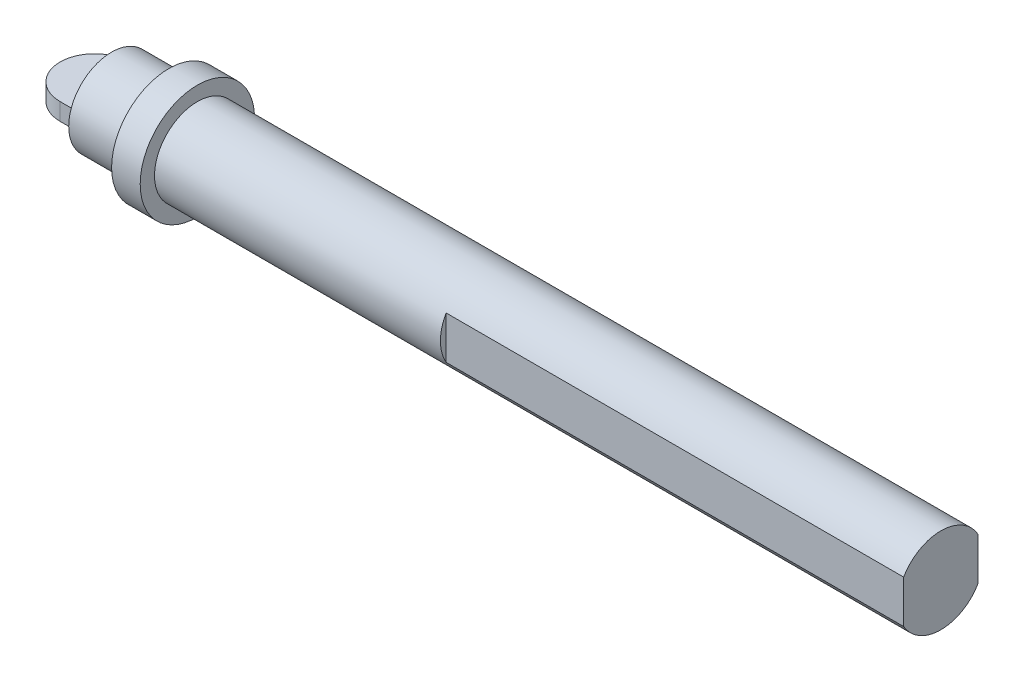
ISO-10303-21;
HEADER;
FILE_DESCRIPTION(('STEP AP214'),'2;1');
FILE_NAME('part.step','',(''),(''),'','','');
FILE_SCHEMA(('AUTOMOTIVE_DESIGN { 1 0 10303 214 1 1 1 1 }'));
ENDSEC;
DATA;
#1=APPLICATION_CONTEXT('core data for automotive mechanical design processes');
#2=APPLICATION_PROTOCOL_DEFINITION('international standard','automotive_design',2000,#1);
#3=PRODUCT_CONTEXT('',#1,'mechanical');
#4=PRODUCT('Part','Part','',(#3));
#5=PRODUCT_RELATED_PRODUCT_CATEGORY('part','',(#4));
#6=PRODUCT_DEFINITION_FORMATION('','',#4);
#7=PRODUCT_DEFINITION_CONTEXT('part definition',#1,'design');
#8=PRODUCT_DEFINITION('design','',#6,#7);
#9=PRODUCT_DEFINITION_SHAPE('','',#8);
#10=(LENGTH_UNIT() NAMED_UNIT(*) SI_UNIT(.MILLI.,.METRE.));
#11=(NAMED_UNIT(*) PLANE_ANGLE_UNIT() SI_UNIT($,.RADIAN.));
#12=(NAMED_UNIT(*) SI_UNIT($,.STERADIAN.) SOLID_ANGLE_UNIT());
#13=UNCERTAINTY_MEASURE_WITH_UNIT(LENGTH_MEASURE(1.E-05),#10,'distance_accuracy_value','');
#14=(GEOMETRIC_REPRESENTATION_CONTEXT(3) GLOBAL_UNCERTAINTY_ASSIGNED_CONTEXT((#13)) GLOBAL_UNIT_ASSIGNED_CONTEXT((#10,
#11,#12)) REPRESENTATION_CONTEXT('',''));
#15=CARTESIAN_POINT('',(0.,0.,0.));
#16=DIRECTION('',(0.,0.,1.));
#17=DIRECTION('',(1.,0.,0.));
#18=AXIS2_PLACEMENT_3D('',#15,#16,#17);
#19=CARTESIAN_POINT('',(145.,7.49999999999998,0.));
#20=DIRECTION('',(-1.,0.,0.));
#21=DIRECTION('',(0.,0.,1.));
#22=AXIS2_PLACEMENT_3D('',#19,#20,#21);
#23=PLANE('',#22);
#24=CARTESIAN_POINT('',(145.,0.,0.));
#25=DIRECTION('',(-1.,0.,0.));
#26=DIRECTION('',(0.,0.,1.));
#27=AXIS2_PLACEMENT_3D('',#24,#25,#26);
#28=CIRCLE('',#27,7.49999999999998);
#29=CARTESIAN_POINT('',(145.,-3.74165738677392,-6.49999999999999));
#30=VERTEX_POINT('',#29);
#31=CARTESIAN_POINT('',(145.,-3.74165738677391,6.5));
#32=VERTEX_POINT('',#31);
#33=EDGE_CURVE('E191',#30,#32,#28,.T.);
#34=ORIENTED_EDGE('',*,*,#33,.F.);
#35=DIRECTION('',(0.,-1.,0.));
#36=VECTOR('',#35,1.);
#37=CARTESIAN_POINT('',(145.,3.74165738677391,-6.5));
#38=LINE('',#37,#36);
#39=CARTESIAN_POINT('',(145.,3.74165738677391,-6.5));
#40=VERTEX_POINT('',#39);
#41=EDGE_CURVE('E160',#40,#30,#38,.T.);
#42=ORIENTED_EDGE('',*,*,#41,.F.);
#43=CARTESIAN_POINT('',(145.,3.74165738677391,6.5));
#44=VERTEX_POINT('',#43);
#45=EDGE_CURVE('E192',#44,#40,#28,.T.);
#46=ORIENTED_EDGE('',*,*,#45,.F.);
#47=DIRECTION('',(0.,-1.,0.));
#48=VECTOR('',#47,1.);
#49=CARTESIAN_POINT('',(145.,3.74165738677391,6.5));
#50=LINE('',#49,#48);
#51=EDGE_CURVE('E164',#44,#32,#50,.T.);
#52=ORIENTED_EDGE('',*,*,#51,.T.);
#53=EDGE_LOOP('',(#34,#42,#46,#52));
#54=FACE_BOUND('',#53,.T.);
#55=ADVANCED_FACE('F65',(#54),#23,.F.);
#56=CARTESIAN_POINT('',(0.,0.,0.));
#57=DIRECTION('',(1.,0.,0.));
#58=DIRECTION('',(0.,0.,-1.));
#59=AXIS2_PLACEMENT_3D('',#56,#57,#58);
#60=PLANE('',#59);
#61=DIRECTION('',(0.,-1.,0.));
#62=VECTOR('',#61,1.);
#63=CARTESIAN_POINT('',(0.,1.5,6.));
#64=LINE('',#63,#62);
#65=CARTESIAN_POINT('',(0.,1.5,6.));
#66=VERTEX_POINT('',#65);
#67=CARTESIAN_POINT('',(0.,-1.5,6.));
#68=VERTEX_POINT('',#67);
#69=EDGE_CURVE('E139',#66,#68,#64,.T.);
#70=ORIENTED_EDGE('',*,*,#69,.T.);
#71=DIRECTION('',(0.,0.,-1.));
#72=VECTOR('',#71,1.);
#73=CARTESIAN_POINT('',(0.,-1.5,-6.));
#74=LINE('',#73,#72);
#75=CARTESIAN_POINT('',(0.,-1.5,-6.));
#76=VERTEX_POINT('',#75);
#77=EDGE_CURVE('E81',#68,#76,#74,.T.);
#78=ORIENTED_EDGE('',*,*,#77,.T.);
#79=DIRECTION('',(0.,-1.,0.));
#80=VECTOR('',#79,1.);
#81=CARTESIAN_POINT('',(0.,1.5,-6.));
#82=LINE('',#81,#80);
#83=CARTESIAN_POINT('',(0.,1.5,-6.));
#84=VERTEX_POINT('',#83);
#85=EDGE_CURVE('E166',#84,#76,#82,.T.);
#86=ORIENTED_EDGE('',*,*,#85,.F.);
#87=DIRECTION('',(0.,0.,-1.));
#88=VECTOR('',#87,1.);
#89=CARTESIAN_POINT('',(0.,1.5,-6.));
#90=LINE('',#89,#88);
#91=EDGE_CURVE('E143',#66,#84,#90,.T.);
#92=ORIENTED_EDGE('',*,*,#91,.F.);
#93=EDGE_LOOP('',(#70,#78,#86,#92));
#94=FACE_BOUND('',#93,.T.);
#95=CARTESIAN_POINT('',(0.,0.,0.));
#96=DIRECTION('',(-1.,0.,0.));
#97=DIRECTION('',(0.,0.,1.));
#98=AXIS2_PLACEMENT_3D('',#95,#96,#97);
#99=CIRCLE('',#98,7.49999999999998);
#100=CARTESIAN_POINT('',(0.,0.,7.49999999999998));
#101=VERTEX_POINT('',#100);
#102=EDGE_CURVE('E211',#101,#101,#99,.T.);
#103=ORIENTED_EDGE('',*,*,#102,.T.);
#104=EDGE_LOOP('',(#103));
#105=FACE_BOUND('',#104,.T.);
#106=ADVANCED_FACE('F67',(#94,#105),#60,.F.);
#107=CARTESIAN_POINT('',(-72.8865979381443,0.,0.));
#108=DIRECTION('',(-1.,0.,0.));
#109=DIRECTION('',(0.,0.,1.));
#110=AXIS2_PLACEMENT_3D('',#107,#108,#109);
#111=CYLINDRICAL_SURFACE('',#110,7.49999999999998);
#112=ORIENTED_EDGE('',*,*,#102,.F.);
#113=EDGE_LOOP('',(#112));
#114=FACE_BOUND('',#113,.T.);
#115=CARTESIAN_POINT('',(9.99999999999999,0.,0.));
#116=DIRECTION('',(-1.,0.,0.));
#117=DIRECTION('',(0.,0.,1.));
#118=AXIS2_PLACEMENT_3D('',#115,#116,#117);
#119=CIRCLE('',#118,7.49999999999998);
#120=CARTESIAN_POINT('',(9.99999999999999,0.,7.49999999999998));
#121=VERTEX_POINT('',#120);
#122=EDGE_CURVE('E208',#121,#121,#119,.T.);
#123=ORIENTED_EDGE('',*,*,#122,.T.);
#124=EDGE_LOOP('',(#123));
#125=FACE_BOUND('',#124,.T.);
#126=ADVANCED_FACE('F251',(#114,#125),#111,.T.);
#127=CARTESIAN_POINT('',(10.,7.49999999999998,0.));
#128=DIRECTION('',(1.,0.,0.));
#129=DIRECTION('',(0.,0.,-1.));
#130=AXIS2_PLACEMENT_3D('',#127,#128,#129);
#131=PLANE('',#130);
#132=ORIENTED_EDGE('',*,*,#122,.F.);
#133=EDGE_LOOP('',(#132));
#134=FACE_BOUND('',#133,.T.);
#135=CARTESIAN_POINT('',(9.99999999999999,0.,0.));
#136=DIRECTION('',(-1.,0.,0.));
#137=DIRECTION('',(0.,0.,1.));
#138=AXIS2_PLACEMENT_3D('',#135,#136,#137);
#139=CIRCLE('',#138,9.99999999999998);
#140=CARTESIAN_POINT('',(9.99999999999999,0.,9.99999999999998));
#141=VERTEX_POINT('',#140);
#142=EDGE_CURVE('E204',#141,#141,#139,.T.);
#143=ORIENTED_EDGE('',*,*,#142,.T.);
#144=EDGE_LOOP('',(#143));
#145=FACE_BOUND('',#144,.T.);
#146=ADVANCED_FACE('F263',(#134,#145),#131,.F.);
#147=CARTESIAN_POINT('',(-72.8865979381443,0.,0.));
#148=DIRECTION('',(-1.,0.,0.));
#149=DIRECTION('',(0.,0.,1.));
#150=AXIS2_PLACEMENT_3D('',#147,#148,#149);
#151=CYLINDRICAL_SURFACE('',#150,9.99999999999998);
#152=ORIENTED_EDGE('',*,*,#142,.F.);
#153=EDGE_LOOP('',(#152));
#154=FACE_BOUND('',#153,.T.);
#155=CARTESIAN_POINT('',(15.,0.,0.));
#156=DIRECTION('',(-1.,0.,0.));
#157=DIRECTION('',(0.,0.,1.));
#158=AXIS2_PLACEMENT_3D('',#155,#156,#157);
#159=CIRCLE('',#158,9.99999999999998);
#160=CARTESIAN_POINT('',(15.,0.,9.99999999999998));
#161=VERTEX_POINT('',#160);
#162=EDGE_CURVE('E200',#161,#161,#159,.T.);
#163=ORIENTED_EDGE('',*,*,#162,.T.);
#164=EDGE_LOOP('',(#163));
#165=FACE_BOUND('',#164,.T.);
#166=ADVANCED_FACE('F259',(#154,#165),#151,.T.);
#167=CARTESIAN_POINT('',(15.,9.99999999999998,0.));
#168=DIRECTION('',(-1.,0.,0.));
#169=DIRECTION('',(0.,0.,1.));
#170=AXIS2_PLACEMENT_3D('',#167,#168,#169);
#171=PLANE('',#170);
#172=ORIENTED_EDGE('',*,*,#162,.F.);
#173=EDGE_LOOP('',(#172));
#174=FACE_BOUND('',#173,.T.);
#175=CARTESIAN_POINT('',(15.,0.,0.));
#176=DIRECTION('',(-1.,0.,0.));
#177=DIRECTION('',(0.,0.,1.));
#178=AXIS2_PLACEMENT_3D('',#175,#176,#177);
#179=CIRCLE('',#178,7.49999999999998);
#180=CARTESIAN_POINT('',(15.,0.,7.49999999999998));
#181=VERTEX_POINT('',#180);
#182=EDGE_CURVE('E196',#181,#181,#179,.T.);
#183=ORIENTED_EDGE('',*,*,#182,.T.);
#184=EDGE_LOOP('',(#183));
#185=FACE_BOUND('',#184,.T.);
#186=ADVANCED_FACE('F256',(#174,#185),#171,.F.);
#187=CARTESIAN_POINT('',(-72.8865979381443,0.,0.));
#188=DIRECTION('',(-1.,0.,0.));
#189=DIRECTION('',(0.,0.,1.));
#190=AXIS2_PLACEMENT_3D('',#187,#188,#189);
#191=CYLINDRICAL_SURFACE('',#190,7.49999999999998);
#192=DIRECTION('',(1.,0.,0.));
#193=VECTOR('',#192,1.);
#194=CARTESIAN_POINT('',(65.,-3.74165738677391,6.5));
#195=LINE('',#194,#193);
#196=CARTESIAN_POINT('',(65.,-3.74165738677391,6.5));
#197=VERTEX_POINT('',#196);
#198=EDGE_CURVE('E89',#197,#32,#195,.T.);
#199=ORIENTED_EDGE('',*,*,#198,.F.);
#200=CARTESIAN_POINT('',(65.,0.,0.));
#201=DIRECTION('',(1.,0.,0.));
#202=DIRECTION('',(0.,0.,-1.));
#203=AXIS2_PLACEMENT_3D('',#200,#201,#202);
#204=CIRCLE('',#203,7.49999999999998);
#205=CARTESIAN_POINT('',(65.,3.74165738677391,6.5));
#206=VERTEX_POINT('',#205);
#207=EDGE_CURVE('E74',#206,#197,#204,.T.);
#208=ORIENTED_EDGE('',*,*,#207,.F.);
#209=DIRECTION('',(1.,0.,0.));
#210=VECTOR('',#209,1.);
#211=CARTESIAN_POINT('',(65.,3.74165738677391,6.5));
#212=LINE('',#211,#210);
#213=EDGE_CURVE('E181',#206,#44,#212,.T.);
#214=ORIENTED_EDGE('',*,*,#213,.T.);
#215=ORIENTED_EDGE('',*,*,#45,.T.);
#216=DIRECTION('',(1.,0.,0.));
#217=VECTOR('',#216,1.);
#218=CARTESIAN_POINT('',(65.,3.74165738677391,-6.5));
#219=LINE('',#218,#217);
#220=CARTESIAN_POINT('',(65.,3.74165738677391,-6.5));
#221=VERTEX_POINT('',#220);
#222=EDGE_CURVE('E175',#221,#40,#219,.T.);
#223=ORIENTED_EDGE('',*,*,#222,.F.);
#224=CARTESIAN_POINT('',(65.,-3.74165738677392,-6.49999999999999));
#225=VERTEX_POINT('',#224);
#226=EDGE_CURVE('E13',#225,#221,#204,.T.);
#227=ORIENTED_EDGE('',*,*,#226,.F.);
#228=DIRECTION('',(1.,0.,0.));
#229=VECTOR('',#228,1.);
#230=CARTESIAN_POINT('',(65.,-3.74165738677392,-6.49999999999999));
#231=LINE('',#230,#229);
#232=EDGE_CURVE('E187',#225,#30,#231,.T.);
#233=ORIENTED_EDGE('',*,*,#232,.T.);
#234=ORIENTED_EDGE('',*,*,#33,.T.);
#235=EDGE_LOOP('',(#199,#208,#214,#215,#223,#227,#233,#234));
#236=FACE_BOUND('',#235,.T.);
#237=ORIENTED_EDGE('',*,*,#182,.F.);
#238=EDGE_LOOP('',(#237));
#239=FACE_BOUND('',#238,.T.);
#240=ADVANCED_FACE('F224',(#236,#239),#191,.T.);
#241=CARTESIAN_POINT('',(65.,3.74165738677391,6.5));
#242=DIRECTION('',(0.,0.,1.));
#243=DIRECTION('',(1.,0.,0.));
#244=AXIS2_PLACEMENT_3D('',#241,#242,#243);
#245=PLANE('',#244);
#246=ORIENTED_EDGE('',*,*,#51,.F.);
#247=ORIENTED_EDGE('',*,*,#213,.F.);
#248=DIRECTION('',(0.,-1.,0.));
#249=VECTOR('',#248,1.);
#250=CARTESIAN_POINT('',(65.,3.74165738677391,6.5));
#251=LINE('',#250,#249);
#252=EDGE_CURVE('E173',#206,#197,#251,.T.);
#253=ORIENTED_EDGE('',*,*,#252,.T.);
#254=ORIENTED_EDGE('',*,*,#198,.T.);
#255=EDGE_LOOP('',(#246,#247,#253,#254));
#256=FACE_BOUND('',#255,.T.);
#257=ADVANCED_FACE('F222',(#256),#245,.T.);
#258=CARTESIAN_POINT('',(65.,-0.53559948569541,0.));
#259=DIRECTION('',(1.,0.,0.));
#260=DIRECTION('',(0.,0.,-1.));
#261=AXIS2_PLACEMENT_3D('',#258,#259,#260);
#262=PLANE('',#261);
#263=ORIENTED_EDGE('',*,*,#207,.T.);
#264=ORIENTED_EDGE('',*,*,#252,.F.);
#265=EDGE_LOOP('',(#263,#264));
#266=FACE_BOUND('',#265,.T.);
#267=ADVANCED_FACE('F219',(#266),#262,.T.);
#268=ORIENTED_EDGE('',*,*,#226,.T.);
#269=DIRECTION('',(0.,-1.,0.));
#270=VECTOR('',#269,1.);
#271=CARTESIAN_POINT('',(65.,3.74165738677391,-6.5));
#272=LINE('',#271,#270);
#273=EDGE_CURVE('E170',#221,#225,#272,.T.);
#274=ORIENTED_EDGE('',*,*,#273,.T.);
#275=EDGE_LOOP('',(#268,#274));
#276=FACE_BOUND('',#275,.T.);
#277=ADVANCED_FACE('F238',(#276),#262,.T.);
#278=CARTESIAN_POINT('',(65.,3.74165738677391,-6.5));
#279=DIRECTION('',(0.,0.,1.));
#280=DIRECTION('',(1.,0.,0.));
#281=AXIS2_PLACEMENT_3D('',#278,#279,#280);
#282=PLANE('',#281);
#283=ORIENTED_EDGE('',*,*,#41,.T.);
#284=ORIENTED_EDGE('',*,*,#232,.F.);
#285=ORIENTED_EDGE('',*,*,#273,.F.);
#286=ORIENTED_EDGE('',*,*,#222,.T.);
#287=EDGE_LOOP('',(#283,#284,#285,#286));
#288=FACE_BOUND('',#287,.T.);
#289=ADVANCED_FACE('F236',(#288),#282,.F.);
#290=CARTESIAN_POINT('',(-3.,1.5,0.));
#291=DIRECTION('',(0.,-1.,0.));
#292=DIRECTION('',(0.,0.,-1.));
#293=AXIS2_PLACEMENT_3D('',#290,#291,#292);
#294=CYLINDRICAL_SURFACE('',#293,6.);
#295=CARTESIAN_POINT('',(-3.,-1.5,0.));
#296=DIRECTION('',(0.,1.,0.));
#297=DIRECTION('',(0.,0.,1.));
#298=AXIS2_PLACEMENT_3D('',#295,#296,#297);
#299=CIRCLE('',#298,6.);
#300=CARTESIAN_POINT('',(-3.,-1.5,-6.));
#301=VERTEX_POINT('',#300);
#302=CARTESIAN_POINT('',(-3.,-1.5,6.));
#303=VERTEX_POINT('',#302);
#304=EDGE_CURVE('E158',#301,#303,#299,.T.);
#305=ORIENTED_EDGE('',*,*,#304,.T.);
#306=DIRECTION('',(0.,-1.,0.));
#307=VECTOR('',#306,1.);
#308=CARTESIAN_POINT('',(-3.,1.5,6.));
#309=LINE('',#308,#307);
#310=CARTESIAN_POINT('',(-3.,1.5,6.));
#311=VERTEX_POINT('',#310);
#312=EDGE_CURVE('E136',#311,#303,#309,.T.);
#313=ORIENTED_EDGE('',*,*,#312,.F.);
#314=CARTESIAN_POINT('',(-3.,1.5,0.));
#315=DIRECTION('',(0.,1.,0.));
#316=DIRECTION('',(0.,0.,1.));
#317=AXIS2_PLACEMENT_3D('',#314,#315,#316);
#318=CIRCLE('',#317,6.);
#319=CARTESIAN_POINT('',(-3.,1.5,-6.));
#320=VERTEX_POINT('',#319);
#321=EDGE_CURVE('E144',#320,#311,#318,.T.);
#322=ORIENTED_EDGE('',*,*,#321,.F.);
#323=DIRECTION('',(0.,-1.,0.));
#324=VECTOR('',#323,1.);
#325=CARTESIAN_POINT('',(-3.,1.5,-6.));
#326=LINE('',#325,#324);
#327=EDGE_CURVE('E380',#320,#301,#326,.T.);
#328=ORIENTED_EDGE('',*,*,#327,.T.);
#329=EDGE_LOOP('',(#305,#313,#322,#328));
#330=FACE_BOUND('',#329,.T.);
#331=ADVANCED_FACE('F156',(#330),#294,.T.);
#332=CARTESIAN_POINT('',(0.,1.5,6.));
#333=DIRECTION('',(0.,0.,-1.));
#334=DIRECTION('',(-1.,0.,0.));
#335=AXIS2_PLACEMENT_3D('',#332,#333,#334);
#336=PLANE('',#335);
#337=DIRECTION('',(1.,0.,0.));
#338=VECTOR('',#337,1.);
#339=CARTESIAN_POINT('',(0.,-1.5,6.));
#340=LINE('',#339,#338);
#341=EDGE_CURVE('E368',#303,#68,#340,.T.);
#342=ORIENTED_EDGE('',*,*,#341,.T.);
#343=ORIENTED_EDGE('',*,*,#69,.F.);
#344=DIRECTION('',(1.,0.,0.));
#345=VECTOR('',#344,1.);
#346=CARTESIAN_POINT('',(0.,1.5,6.));
#347=LINE('',#346,#345);
#348=EDGE_CURVE('E132',#311,#66,#347,.T.);
#349=ORIENTED_EDGE('',*,*,#348,.F.);
#350=ORIENTED_EDGE('',*,*,#312,.T.);
#351=EDGE_LOOP('',(#342,#343,#349,#350));
#352=FACE_BOUND('',#351,.T.);
#353=ADVANCED_FACE('F134',(#352),#336,.F.);
#354=CARTESIAN_POINT('',(-3.,1.5,-6.));
#355=DIRECTION('',(0.,0.,1.));
#356=DIRECTION('',(1.,0.,0.));
#357=AXIS2_PLACEMENT_3D('',#354,#355,#356);
#358=PLANE('',#357);
#359=DIRECTION('',(-1.,0.,0.));
#360=VECTOR('',#359,1.);
#361=CARTESIAN_POINT('',(-3.,-1.5,-6.));
#362=LINE('',#361,#360);
#363=EDGE_CURVE('E154',#76,#301,#362,.T.);
#364=ORIENTED_EDGE('',*,*,#363,.T.);
#365=ORIENTED_EDGE('',*,*,#327,.F.);
#366=DIRECTION('',(-1.,0.,0.));
#367=VECTOR('',#366,1.);
#368=CARTESIAN_POINT('',(-3.,1.5,-6.));
#369=LINE('',#368,#367);
#370=EDGE_CURVE('E149',#84,#320,#369,.T.);
#371=ORIENTED_EDGE('',*,*,#370,.F.);
#372=ORIENTED_EDGE('',*,*,#85,.T.);
#373=EDGE_LOOP('',(#364,#365,#371,#372));
#374=FACE_BOUND('',#373,.T.);
#375=ADVANCED_FACE('F338',(#374),#358,.F.);
#376=CARTESIAN_POINT('',(-3.,1.5,0.));
#377=DIRECTION('',(0.,1.,0.));
#378=DIRECTION('',(0.,0.,1.));
#379=AXIS2_PLACEMENT_3D('',#376,#377,#378);
#380=PLANE('',#379);
#381=ORIENTED_EDGE('',*,*,#321,.T.);
#382=ORIENTED_EDGE('',*,*,#348,.T.);
#383=ORIENTED_EDGE('',*,*,#91,.T.);
#384=ORIENTED_EDGE('',*,*,#370,.T.);
#385=EDGE_LOOP('',(#381,#382,#383,#384));
#386=FACE_BOUND('',#385,.T.);
#387=ADVANCED_FACE('F147',(#386),#380,.T.);
#388=CARTESIAN_POINT('',(-3.,-1.5,0.));
#389=DIRECTION('',(0.,1.,0.));
#390=DIRECTION('',(0.,0.,1.));
#391=AXIS2_PLACEMENT_3D('',#388,#389,#390);
#392=PLANE('',#391);
#393=ORIENTED_EDGE('',*,*,#304,.F.);
#394=ORIENTED_EDGE('',*,*,#363,.F.);
#395=ORIENTED_EDGE('',*,*,#77,.F.);
#396=ORIENTED_EDGE('',*,*,#341,.F.);
#397=EDGE_LOOP('',(#393,#394,#395,#396));
#398=FACE_BOUND('',#397,.T.);
#399=ADVANCED_FACE('F356',(#398),#392,.F.);
#400=CLOSED_SHELL('',(#55,#106,#126,#146,#166,#186,#240,#257,#267,#277,#289,#331,#353,#375,#387,#399));
#401=MANIFOLD_SOLID_BREP('B2',#400);
#402=ADVANCED_BREP_SHAPE_REPRESENTATION('',(#18,#401),#14);
#403=SHAPE_DEFINITION_REPRESENTATION(#9,#402);
ENDSEC;
END-ISO-10303-21;
